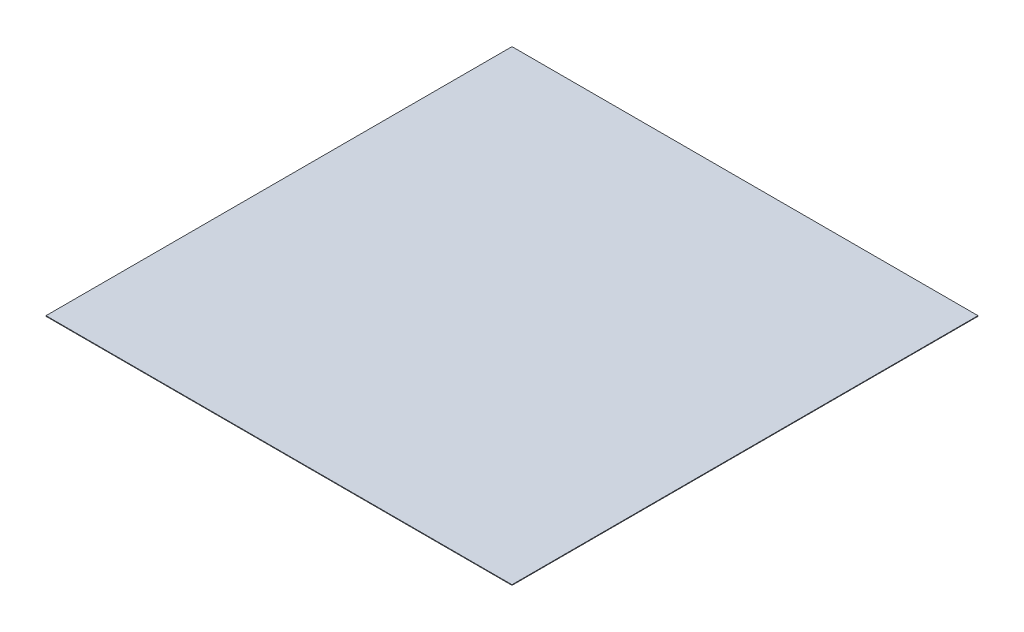
ISO-10303-21;
HEADER;
FILE_DESCRIPTION(('STEP AP214'),'2;1');
FILE_NAME('part.step','',(''),(''),'','','');
FILE_SCHEMA(('AUTOMOTIVE_DESIGN { 1 0 10303 214 1 1 1 1 }'));
ENDSEC;
DATA;
#1=APPLICATION_CONTEXT('core data for automotive mechanical design processes');
#2=APPLICATION_PROTOCOL_DEFINITION('international standard','automotive_design',2000,#1);
#3=PRODUCT_CONTEXT('',#1,'mechanical');
#4=PRODUCT('Part','Part','',(#3));
#5=PRODUCT_RELATED_PRODUCT_CATEGORY('part','',(#4));
#6=PRODUCT_DEFINITION_FORMATION('','',#4);
#7=PRODUCT_DEFINITION_CONTEXT('part definition',#1,'design');
#8=PRODUCT_DEFINITION('design','',#6,#7);
#9=PRODUCT_DEFINITION_SHAPE('','',#8);
#10=(LENGTH_UNIT() NAMED_UNIT(*) SI_UNIT(.MILLI.,.METRE.));
#11=(NAMED_UNIT(*) PLANE_ANGLE_UNIT() SI_UNIT($,.RADIAN.));
#12=(NAMED_UNIT(*) SI_UNIT($,.STERADIAN.) SOLID_ANGLE_UNIT());
#13=UNCERTAINTY_MEASURE_WITH_UNIT(LENGTH_MEASURE(1.E-05),#10,'distance_accuracy_value','');
#14=(GEOMETRIC_REPRESENTATION_CONTEXT(3) GLOBAL_UNCERTAINTY_ASSIGNED_CONTEXT((#13)) GLOBAL_UNIT_ASSIGNED_CONTEXT((#10,
#11,#12)) REPRESENTATION_CONTEXT('',''));
#15=CARTESIAN_POINT('',(0.,0.,0.));
#16=DIRECTION('',(0.,0.,1.));
#17=DIRECTION('',(1.,0.,0.));
#18=AXIS2_PLACEMENT_3D('',#15,#16,#17);
#19=CARTESIAN_POINT('',(0.,4.23333333333333,0.));
#20=DIRECTION('',(1.,0.,0.));
#21=DIRECTION('',(0.,0.,-1.));
#22=AXIS2_PLACEMENT_3D('',#19,#20,#21);
#23=PLANE('',#22);
#24=DIRECTION('',(0.,0.,1.));
#25=VECTOR('',#24,1.);
#26=CARTESIAN_POINT('',(0.,0.,0.));
#27=LINE('',#26,#25);
#28=CARTESIAN_POINT('',(0.,0.,0.));
#29=VERTEX_POINT('',#28);
#30=CARTESIAN_POINT('',(4.05358090517774E-13,0.,3310.));
#31=VERTEX_POINT('',#30);
#32=EDGE_CURVE('E98',#29,#31,#27,.T.);
#33=ORIENTED_EDGE('',*,*,#32,.T.);
#34=DIRECTION('',(0.,-1.,0.));
#35=VECTOR('',#34,1.);
#36=CARTESIAN_POINT('',(4.05358090517774E-13,4.23333333333333,3310.));
#37=LINE('',#36,#35);
#38=CARTESIAN_POINT('',(4.05358090517774E-13,4.23333333333333,3310.));
#39=VERTEX_POINT('',#38);
#40=EDGE_CURVE('E11',#39,#31,#37,.T.);
#41=ORIENTED_EDGE('',*,*,#40,.F.);
#42=DIRECTION('',(0.,0.,1.));
#43=VECTOR('',#42,1.);
#44=CARTESIAN_POINT('',(0.,4.23333333333333,0.));
#45=LINE('',#44,#43);
#46=CARTESIAN_POINT('',(0.,4.23333333333333,0.));
#47=VERTEX_POINT('',#46);
#48=EDGE_CURVE('E86',#47,#39,#45,.T.);
#49=ORIENTED_EDGE('',*,*,#48,.F.);
#50=DIRECTION('',(0.,-1.,0.));
#51=VECTOR('',#50,1.);
#52=CARTESIAN_POINT('',(0.,4.23333333333333,0.));
#53=LINE('',#52,#51);
#54=EDGE_CURVE('E94',#47,#29,#53,.T.);
#55=ORIENTED_EDGE('',*,*,#54,.T.);
#56=EDGE_LOOP('',(#33,#41,#49,#55));
#57=FACE_BOUND('',#56,.T.);
#58=ADVANCED_FACE('F35',(#57),#23,.F.);
#59=CARTESIAN_POINT('',(4.05358090517774E-13,4.23333333333333,3310.));
#60=DIRECTION('',(0.,0.,-1.));
#61=DIRECTION('',(-1.,0.,0.));
#62=AXIS2_PLACEMENT_3D('',#59,#60,#61);
#63=PLANE('',#62);
#64=DIRECTION('',(1.,0.,0.));
#65=VECTOR('',#64,1.);
#66=CARTESIAN_POINT('',(4.05358090517774E-13,0.,3310.));
#67=LINE('',#66,#65);
#68=CARTESIAN_POINT('',(3310.,0.,3310.));
#69=VERTEX_POINT('',#68);
#70=EDGE_CURVE('E90',#31,#69,#67,.T.);
#71=ORIENTED_EDGE('',*,*,#70,.T.);
#72=DIRECTION('',(0.,-1.,0.));
#73=VECTOR('',#72,1.);
#74=CARTESIAN_POINT('',(3310.,4.23333333333333,3310.));
#75=LINE('',#74,#73);
#76=CARTESIAN_POINT('',(3310.,4.23333333333333,3310.));
#77=VERTEX_POINT('',#76);
#78=EDGE_CURVE('E43',#77,#69,#75,.T.);
#79=ORIENTED_EDGE('',*,*,#78,.F.);
#80=DIRECTION('',(1.,0.,0.));
#81=VECTOR('',#80,1.);
#82=CARTESIAN_POINT('',(4.05358090517774E-13,4.23333333333333,3310.));
#83=LINE('',#82,#81);
#84=EDGE_CURVE('E81',#39,#77,#83,.T.);
#85=ORIENTED_EDGE('',*,*,#84,.F.);
#86=ORIENTED_EDGE('',*,*,#40,.T.);
#87=EDGE_LOOP('',(#71,#79,#85,#86));
#88=FACE_BOUND('',#87,.T.);
#89=ADVANCED_FACE('F89',(#88),#63,.F.);
#90=CARTESIAN_POINT('',(3310.,4.23333333333333,0.));
#91=DIRECTION('',(-1.,0.,0.));
#92=DIRECTION('',(0.,0.,1.));
#93=AXIS2_PLACEMENT_3D('',#90,#91,#92);
#94=PLANE('',#93);
#95=DIRECTION('',(0.,0.,-1.));
#96=VECTOR('',#95,1.);
#97=CARTESIAN_POINT('',(3310.,0.,0.));
#98=LINE('',#97,#96);
#99=CARTESIAN_POINT('',(3310.,0.,0.));
#100=VERTEX_POINT('',#99);
#101=EDGE_CURVE('E68',#69,#100,#98,.T.);
#102=ORIENTED_EDGE('',*,*,#101,.T.);
#103=DIRECTION('',(0.,-1.,0.));
#104=VECTOR('',#103,1.);
#105=CARTESIAN_POINT('',(3310.,4.23333333333333,0.));
#106=LINE('',#105,#104);
#107=CARTESIAN_POINT('',(3310.,4.23333333333333,0.));
#108=VERTEX_POINT('',#107);
#109=EDGE_CURVE('E91',#108,#100,#106,.T.);
#110=ORIENTED_EDGE('',*,*,#109,.F.);
#111=DIRECTION('',(0.,0.,-1.));
#112=VECTOR('',#111,1.);
#113=CARTESIAN_POINT('',(3310.,4.23333333333333,0.));
#114=LINE('',#113,#112);
#115=EDGE_CURVE('E84',#77,#108,#114,.T.);
#116=ORIENTED_EDGE('',*,*,#115,.F.);
#117=ORIENTED_EDGE('',*,*,#78,.T.);
#118=EDGE_LOOP('',(#102,#110,#116,#117));
#119=FACE_BOUND('',#118,.T.);
#120=ADVANCED_FACE('F92',(#119),#94,.F.);
#121=CARTESIAN_POINT('',(0.,4.23333333333333,0.));
#122=DIRECTION('',(0.,0.,1.));
#123=DIRECTION('',(1.,0.,0.));
#124=AXIS2_PLACEMENT_3D('',#121,#122,#123);
#125=PLANE('',#124);
#126=DIRECTION('',(-1.,0.,0.));
#127=VECTOR('',#126,1.);
#128=CARTESIAN_POINT('',(0.,0.,0.));
#129=LINE('',#128,#127);
#130=EDGE_CURVE('E74',#100,#29,#129,.T.);
#131=ORIENTED_EDGE('',*,*,#130,.T.);
#132=ORIENTED_EDGE('',*,*,#54,.F.);
#133=DIRECTION('',(-1.,0.,0.));
#134=VECTOR('',#133,1.);
#135=CARTESIAN_POINT('',(0.,4.23333333333333,0.));
#136=LINE('',#135,#134);
#137=EDGE_CURVE('E51',#108,#47,#136,.T.);
#138=ORIENTED_EDGE('',*,*,#137,.F.);
#139=ORIENTED_EDGE('',*,*,#109,.T.);
#140=EDGE_LOOP('',(#131,#132,#138,#139));
#141=FACE_BOUND('',#140,.T.);
#142=ADVANCED_FACE('F105',(#141),#125,.F.);
#143=CARTESIAN_POINT('',(0.,4.23333333333333,0.));
#144=DIRECTION('',(0.,1.,0.));
#145=DIRECTION('',(0.,0.,1.));
#146=AXIS2_PLACEMENT_3D('',#143,#144,#145);
#147=PLANE('',#146);
#148=ORIENTED_EDGE('',*,*,#48,.T.);
#149=ORIENTED_EDGE('',*,*,#84,.T.);
#150=ORIENTED_EDGE('',*,*,#115,.T.);
#151=ORIENTED_EDGE('',*,*,#137,.T.);
#152=EDGE_LOOP('',(#148,#149,#150,#151));
#153=FACE_BOUND('',#152,.T.);
#154=ADVANCED_FACE('F82',(#153),#147,.T.);
#155=CARTESIAN_POINT('',(0.,0.,0.));
#156=DIRECTION('',(0.,1.,0.));
#157=DIRECTION('',(0.,0.,1.));
#158=AXIS2_PLACEMENT_3D('',#155,#156,#157);
#159=PLANE('',#158);
#160=ORIENTED_EDGE('',*,*,#32,.F.);
#161=ORIENTED_EDGE('',*,*,#130,.F.);
#162=ORIENTED_EDGE('',*,*,#101,.F.);
#163=ORIENTED_EDGE('',*,*,#70,.F.);
#164=EDGE_LOOP('',(#160,#161,#162,#163));
#165=FACE_BOUND('',#164,.T.);
#166=ADVANCED_FACE('F108',(#165),#159,.F.);
#167=CLOSED_SHELL('',(#58,#89,#120,#142,#154,#166));
#168=MANIFOLD_SOLID_BREP('B2',#167);
#169=ADVANCED_BREP_SHAPE_REPRESENTATION('',(#18,#168),#14);
#170=SHAPE_DEFINITION_REPRESENTATION(#9,#169);
ENDSEC;
END-ISO-10303-21;
